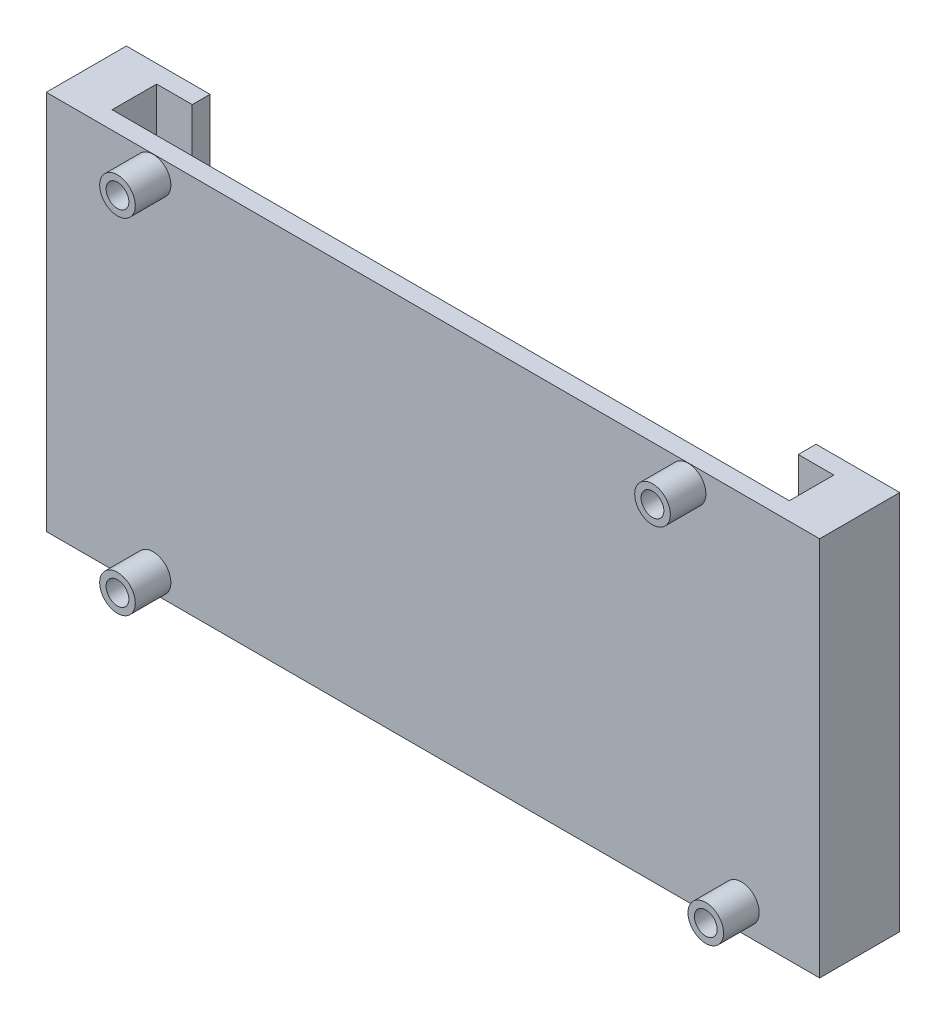
ISO-10303-21;
HEADER;
FILE_DESCRIPTION(('STEP AP214'),'2;1');
FILE_NAME('part.step','',(''),(''),'','','');
FILE_SCHEMA(('AUTOMOTIVE_DESIGN { 1 0 10303 214 1 1 1 1 }'));
ENDSEC;
DATA;
#1=APPLICATION_CONTEXT('core data for automotive mechanical design processes');
#2=APPLICATION_PROTOCOL_DEFINITION('international standard','automotive_design',2000,#1);
#3=PRODUCT_CONTEXT('',#1,'mechanical');
#4=PRODUCT('Part','Part','',(#3));
#5=PRODUCT_RELATED_PRODUCT_CATEGORY('part','',(#4));
#6=PRODUCT_DEFINITION_FORMATION('','',#4);
#7=PRODUCT_DEFINITION_CONTEXT('part definition',#1,'design');
#8=PRODUCT_DEFINITION('design','',#6,#7);
#9=PRODUCT_DEFINITION_SHAPE('','',#8);
#10=(LENGTH_UNIT() NAMED_UNIT(*) SI_UNIT(.MILLI.,.METRE.));
#11=(NAMED_UNIT(*) PLANE_ANGLE_UNIT() SI_UNIT($,.RADIAN.));
#12=(NAMED_UNIT(*) SI_UNIT($,.STERADIAN.) SOLID_ANGLE_UNIT());
#13=UNCERTAINTY_MEASURE_WITH_UNIT(LENGTH_MEASURE(1.E-05),#10,'distance_accuracy_value','');
#14=(GEOMETRIC_REPRESENTATION_CONTEXT(3) GLOBAL_UNCERTAINTY_ASSIGNED_CONTEXT((#13)) GLOBAL_UNIT_ASSIGNED_CONTEXT((#10,
#11,#12)) REPRESENTATION_CONTEXT('',''));
#15=CARTESIAN_POINT('',(0.,0.,0.));
#16=DIRECTION('',(0.,0.,1.));
#17=DIRECTION('',(1.,0.,0.));
#18=AXIS2_PLACEMENT_3D('',#15,#16,#17);
#19=CARTESIAN_POINT('',(-47.55,26.7081,-8.75));
#20=DIRECTION('',(-1.,0.,0.));
#21=DIRECTION('',(0.,-1.,0.));
#22=AXIS2_PLACEMENT_3D('',#19,#20,#21);
#23=PLANE('',#22);
#24=DIRECTION('',(0.,-1.,0.));
#25=VECTOR('',#24,1.);
#26=CARTESIAN_POINT('',(-47.55,26.7081,-6.25));
#27=LINE('',#26,#25);
#28=CARTESIAN_POINT('',(-47.55,26.7081,-6.25));
#29=VERTEX_POINT('',#28);
#30=CARTESIAN_POINT('',(-47.55,-26.7081,-6.25000000000001));
#31=VERTEX_POINT('',#30);
#32=EDGE_CURVE('E167',#29,#31,#27,.T.);
#33=ORIENTED_EDGE('',*,*,#32,.F.);
#34=DIRECTION('',(0.,0.,1.));
#35=VECTOR('',#34,1.);
#36=CARTESIAN_POINT('',(-47.55,26.7081,-8.75));
#37=LINE('',#36,#35);
#38=CARTESIAN_POINT('',(-47.55,26.7081,0.));
#39=VERTEX_POINT('',#38);
#40=EDGE_CURVE('E209',#29,#39,#37,.T.);
#41=ORIENTED_EDGE('',*,*,#40,.T.);
#42=DIRECTION('',(0.,-1.,0.));
#43=VECTOR('',#42,1.);
#44=CARTESIAN_POINT('',(-47.55,26.7081,0.));
#45=LINE('',#44,#43);
#46=CARTESIAN_POINT('',(-47.55,-26.7081,0.));
#47=VERTEX_POINT('',#46);
#48=EDGE_CURVE('E214',#39,#47,#45,.T.);
#49=ORIENTED_EDGE('',*,*,#48,.T.);
#50=DIRECTION('',(0.,0.,1.));
#51=VECTOR('',#50,1.);
#52=CARTESIAN_POINT('',(-47.55,-26.7081,-8.75));
#53=LINE('',#52,#51);
#54=EDGE_CURVE('E61',#31,#47,#53,.T.);
#55=ORIENTED_EDGE('',*,*,#54,.F.);
#56=EDGE_LOOP('',(#33,#41,#49,#55));
#57=FACE_BOUND('',#56,.T.);
#58=ADVANCED_FACE('F45',(#57),#23,.F.);
#59=CARTESIAN_POINT('',(47.55,26.7081,-8.75));
#60=DIRECTION('',(1.,0.,0.));
#61=DIRECTION('',(0.,1.,0.));
#62=AXIS2_PLACEMENT_3D('',#59,#60,#61);
#63=PLANE('',#62);
#64=DIRECTION('',(0.,1.,0.));
#65=VECTOR('',#64,1.);
#66=CARTESIAN_POINT('',(47.55,26.7081,-6.25));
#67=LINE('',#66,#65);
#68=CARTESIAN_POINT('',(47.55,-26.7081,-6.24999999999999));
#69=VERTEX_POINT('',#68);
#70=CARTESIAN_POINT('',(47.55,26.7081,-6.25));
#71=VERTEX_POINT('',#70);
#72=EDGE_CURVE('E185',#69,#71,#67,.T.);
#73=ORIENTED_EDGE('',*,*,#72,.F.);
#74=DIRECTION('',(0.,0.,1.));
#75=VECTOR('',#74,1.);
#76=CARTESIAN_POINT('',(47.55,-26.7081,-8.75));
#77=LINE('',#76,#75);
#78=CARTESIAN_POINT('',(47.55,-26.7081,0.));
#79=VERTEX_POINT('',#78);
#80=EDGE_CURVE('E69',#69,#79,#77,.T.);
#81=ORIENTED_EDGE('',*,*,#80,.T.);
#82=DIRECTION('',(0.,1.,0.));
#83=VECTOR('',#82,1.);
#84=CARTESIAN_POINT('',(47.55,26.7081,0.));
#85=LINE('',#84,#83);
#86=CARTESIAN_POINT('',(47.55,26.7081,0.));
#87=VERTEX_POINT('',#86);
#88=EDGE_CURVE('E217',#79,#87,#85,.T.);
#89=ORIENTED_EDGE('',*,*,#88,.T.);
#90=DIRECTION('',(0.,0.,1.));
#91=VECTOR('',#90,1.);
#92=CARTESIAN_POINT('',(47.55,26.7081,-8.75));
#93=LINE('',#92,#91);
#94=EDGE_CURVE('E233',#71,#87,#93,.T.);
#95=ORIENTED_EDGE('',*,*,#94,.F.);
#96=EDGE_LOOP('',(#73,#81,#89,#95));
#97=FACE_BOUND('',#96,.T.);
#98=ADVANCED_FACE('F364',(#97),#63,.F.);
#99=CARTESIAN_POINT('',(0.,0.,0.));
#100=DIRECTION('',(0.,0.,-1.));
#101=DIRECTION('',(-1.,0.,0.));
#102=AXIS2_PLACEMENT_3D('',#99,#100,#101);
#103=PLANE('',#102);
#104=CARTESIAN_POINT('',(-39.3,24.1681,0.));
#105=DIRECTION('',(0.,0.,1.));
#106=DIRECTION('',(1.,0.,0.));
#107=AXIS2_PLACEMENT_3D('',#104,#105,#106);
#108=CIRCLE('',#107,1.6);
#109=CARTESIAN_POINT('',(-37.7,24.1681,0.));
#110=VERTEX_POINT('',#109);
#111=EDGE_CURVE('E244',#110,#110,#108,.T.);
#112=ORIENTED_EDGE('',*,*,#111,.T.);
#113=EDGE_LOOP('',(#112));
#114=FACE_BOUND('',#113,.T.);
#115=CARTESIAN_POINT('',(35.83,24.1681,0.));
#116=DIRECTION('',(0.,0.,1.));
#117=DIRECTION('',(1.,0.,0.));
#118=AXIS2_PLACEMENT_3D('',#115,#116,#117);
#119=CIRCLE('',#118,1.6);
#120=CARTESIAN_POINT('',(37.43,24.1681,0.));
#121=VERTEX_POINT('',#120);
#122=EDGE_CURVE('E252',#121,#121,#119,.T.);
#123=ORIENTED_EDGE('',*,*,#122,.T.);
#124=EDGE_LOOP('',(#123));
#125=FACE_BOUND('',#124,.T.);
#126=CARTESIAN_POINT('',(43.3118562919391,-23.00810902,0.));
#127=DIRECTION('',(0.,0.,1.));
#128=DIRECTION('',(1.,0.,0.));
#129=AXIS2_PLACEMENT_3D('',#126,#127,#128);
#130=CIRCLE('',#129,1.6);
#131=CARTESIAN_POINT('',(44.9118562919391,-23.00810902,0.));
#132=VERTEX_POINT('',#131);
#133=EDGE_CURVE('E260',#132,#132,#130,.T.);
#134=ORIENTED_EDGE('',*,*,#133,.T.);
#135=EDGE_LOOP('',(#134));
#136=FACE_BOUND('',#135,.T.);
#137=CARTESIAN_POINT('',(-39.3,-24.16810902,0.));
#138=DIRECTION('',(0.,0.,1.));
#139=DIRECTION('',(1.,0.,0.));
#140=AXIS2_PLACEMENT_3D('',#137,#138,#139);
#141=CIRCLE('',#140,1.6);
#142=CARTESIAN_POINT('',(-37.7,-24.16810902,0.));
#143=VERTEX_POINT('',#142);
#144=EDGE_CURVE('E268',#143,#143,#141,.T.);
#145=ORIENTED_EDGE('',*,*,#144,.T.);
#146=EDGE_LOOP('',(#145));
#147=FACE_BOUND('',#146,.T.);
#148=DIRECTION('',(1.,0.,0.));
#149=VECTOR('',#148,1.);
#150=CARTESIAN_POINT('',(-54.3,-26.7081,0.));
#151=LINE('',#150,#149);
#152=EDGE_CURVE('E294',#47,#79,#151,.T.);
#153=ORIENTED_EDGE('',*,*,#152,.F.);
#154=ORIENTED_EDGE('',*,*,#48,.F.);
#155=DIRECTION('',(-1.,0.,0.));
#156=VECTOR('',#155,1.);
#157=CARTESIAN_POINT('',(-54.3,26.7081,0.));
#158=LINE('',#157,#156);
#159=EDGE_CURVE('E288',#87,#39,#158,.T.);
#160=ORIENTED_EDGE('',*,*,#159,.F.);
#161=ORIENTED_EDGE('',*,*,#88,.F.);
#162=EDGE_LOOP('',(#153,#154,#160,#161));
#163=FACE_BOUND('',#162,.T.);
#164=ADVANCED_FACE('F368',(#114,#125,#136,#147,#163),#103,.T.);
#165=CARTESIAN_POINT('',(54.3,-26.7081,2.5));
#166=DIRECTION('',(-1.,0.,0.));
#167=DIRECTION('',(0.,0.,1.));
#168=AXIS2_PLACEMENT_3D('',#165,#166,#167);
#169=PLANE('',#168);
#170=DIRECTION('',(0.,0.,-1.));
#171=VECTOR('',#170,1.);
#172=CARTESIAN_POINT('',(54.3,-26.7081,2.5));
#173=LINE('',#172,#171);
#174=CARTESIAN_POINT('',(54.3,-26.7081,2.5));
#175=VERTEX_POINT('',#174);
#176=CARTESIAN_POINT('',(54.3,-26.7081,-8.75));
#177=VERTEX_POINT('',#176);
#178=EDGE_CURVE('E303',#175,#177,#173,.T.);
#179=ORIENTED_EDGE('',*,*,#178,.T.);
#180=DIRECTION('',(0.,-1.,0.));
#181=VECTOR('',#180,1.);
#182=CARTESIAN_POINT('',(54.3,26.7081,-8.75));
#183=LINE('',#182,#181);
#184=CARTESIAN_POINT('',(54.3,26.7081,-8.75));
#185=VERTEX_POINT('',#184);
#186=EDGE_CURVE('E222',#185,#177,#183,.T.);
#187=ORIENTED_EDGE('',*,*,#186,.F.);
#188=DIRECTION('',(0.,0.,-1.));
#189=VECTOR('',#188,1.);
#190=CARTESIAN_POINT('',(54.3,26.7081,2.5));
#191=LINE('',#190,#189);
#192=CARTESIAN_POINT('',(54.3,26.7081,2.5));
#193=VERTEX_POINT('',#192);
#194=EDGE_CURVE('E317',#193,#185,#191,.T.);
#195=ORIENTED_EDGE('',*,*,#194,.F.);
#196=DIRECTION('',(0.,1.,0.));
#197=VECTOR('',#196,1.);
#198=CARTESIAN_POINT('',(54.3,-26.7081,2.5));
#199=LINE('',#198,#197);
#200=EDGE_CURVE('E289',#175,#193,#199,.T.);
#201=ORIENTED_EDGE('',*,*,#200,.F.);
#202=EDGE_LOOP('',(#179,#187,#195,#201));
#203=FACE_BOUND('',#202,.T.);
#204=ADVANCED_FACE('F47',(#203),#169,.F.);
#205=CARTESIAN_POINT('',(-54.3,26.7081,2.5));
#206=DIRECTION('',(0.,-1.,0.));
#207=DIRECTION('',(0.,0.,-1.));
#208=AXIS2_PLACEMENT_3D('',#205,#206,#207);
#209=PLANE('',#208);
#210=ORIENTED_EDGE('',*,*,#194,.T.);
#211=DIRECTION('',(1.,0.,0.));
#212=VECTOR('',#211,1.);
#213=CARTESIAN_POINT('',(54.3,26.7081,-8.75));
#214=LINE('',#213,#212);
#215=CARTESIAN_POINT('',(42.55,26.7081,-8.75));
#216=VERTEX_POINT('',#215);
#217=EDGE_CURVE('E229',#216,#185,#214,.T.);
#218=ORIENTED_EDGE('',*,*,#217,.F.);
#219=DIRECTION('',(0.,0.,-1.));
#220=VECTOR('',#219,1.);
#221=CARTESIAN_POINT('',(42.55,26.7081,-8.75));
#222=LINE('',#221,#220);
#223=CARTESIAN_POINT('',(42.55,26.7081,-6.25));
#224=VERTEX_POINT('',#223);
#225=EDGE_CURVE('E196',#224,#216,#222,.T.);
#226=ORIENTED_EDGE('',*,*,#225,.F.);
#227=DIRECTION('',(1.,0.,0.));
#228=VECTOR('',#227,1.);
#229=CARTESIAN_POINT('',(42.55,26.7081,-6.25));
#230=LINE('',#229,#228);
#231=EDGE_CURVE('E200',#224,#71,#230,.T.);
#232=ORIENTED_EDGE('',*,*,#231,.T.);
#233=ORIENTED_EDGE('',*,*,#94,.T.);
#234=ORIENTED_EDGE('',*,*,#159,.T.);
#235=ORIENTED_EDGE('',*,*,#40,.F.);
#236=DIRECTION('',(-1.,0.,0.));
#237=VECTOR('',#236,1.);
#238=CARTESIAN_POINT('',(-42.55,26.7081,-6.25));
#239=LINE('',#238,#237);
#240=CARTESIAN_POINT('',(-42.55,26.7081,-6.25));
#241=VERTEX_POINT('',#240);
#242=EDGE_CURVE('E156',#241,#29,#239,.T.);
#243=ORIENTED_EDGE('',*,*,#242,.F.);
#244=DIRECTION('',(0.,0.,1.));
#245=VECTOR('',#244,1.);
#246=CARTESIAN_POINT('',(-42.55,26.7081,-8.75));
#247=LINE('',#246,#245);
#248=CARTESIAN_POINT('',(-42.55,26.7081,-8.75));
#249=VERTEX_POINT('',#248);
#250=EDGE_CURVE('E153',#249,#241,#247,.T.);
#251=ORIENTED_EDGE('',*,*,#250,.F.);
#252=DIRECTION('',(1.,0.,0.));
#253=VECTOR('',#252,1.);
#254=CARTESIAN_POINT('',(-54.3,26.7081,-8.75));
#255=LINE('',#254,#253);
#256=CARTESIAN_POINT('',(-54.3,26.7081,-8.75));
#257=VERTEX_POINT('',#256);
#258=EDGE_CURVE('E139',#257,#249,#255,.T.);
#259=ORIENTED_EDGE('',*,*,#258,.F.);
#260=DIRECTION('',(0.,0.,-1.));
#261=VECTOR('',#260,1.);
#262=CARTESIAN_POINT('',(-54.3,26.7081,2.5));
#263=LINE('',#262,#261);
#264=CARTESIAN_POINT('',(-54.3,26.7081,2.5));
#265=VERTEX_POINT('',#264);
#266=EDGE_CURVE('E314',#265,#257,#263,.T.);
#267=ORIENTED_EDGE('',*,*,#266,.F.);
#268=DIRECTION('',(-1.,0.,0.));
#269=VECTOR('',#268,1.);
#270=CARTESIAN_POINT('',(-54.3,26.7081,2.5));
#271=LINE('',#270,#269);
#272=EDGE_CURVE('E293',#193,#265,#271,.T.);
#273=ORIENTED_EDGE('',*,*,#272,.F.);
#274=EDGE_LOOP('',(#210,#218,#226,#232,#233,#234,#235,#243,#251,#259,#267,#273));
#275=FACE_BOUND('',#274,.T.);
#276=ADVANCED_FACE('F154',(#275),#209,.F.);
#277=CARTESIAN_POINT('',(-54.3,-26.7081,2.5));
#278=DIRECTION('',(1.,0.,0.));
#279=DIRECTION('',(0.,0.,-1.));
#280=AXIS2_PLACEMENT_3D('',#277,#278,#279);
#281=PLANE('',#280);
#282=ORIENTED_EDGE('',*,*,#266,.T.);
#283=DIRECTION('',(0.,1.,0.));
#284=VECTOR('',#283,1.);
#285=CARTESIAN_POINT('',(-54.3,26.7081,-8.75));
#286=LINE('',#285,#284);
#287=CARTESIAN_POINT('',(-54.3,-26.7081,-8.75));
#288=VERTEX_POINT('',#287);
#289=EDGE_CURVE('E146',#288,#257,#286,.T.);
#290=ORIENTED_EDGE('',*,*,#289,.F.);
#291=DIRECTION('',(0.,0.,-1.));
#292=VECTOR('',#291,1.);
#293=CARTESIAN_POINT('',(-54.3,-26.7081,2.5));
#294=LINE('',#293,#292);
#295=CARTESIAN_POINT('',(-54.3,-26.7081,2.5));
#296=VERTEX_POINT('',#295);
#297=EDGE_CURVE('E311',#296,#288,#294,.T.);
#298=ORIENTED_EDGE('',*,*,#297,.F.);
#299=DIRECTION('',(0.,-1.,0.));
#300=VECTOR('',#299,1.);
#301=CARTESIAN_POINT('',(-54.3,-26.7081,2.5));
#302=LINE('',#301,#300);
#303=EDGE_CURVE('E297',#265,#296,#302,.T.);
#304=ORIENTED_EDGE('',*,*,#303,.F.);
#305=EDGE_LOOP('',(#282,#290,#298,#304));
#306=FACE_BOUND('',#305,.T.);
#307=ADVANCED_FACE('F377',(#306),#281,.F.);
#308=CARTESIAN_POINT('',(-54.3,-26.7081,2.5));
#309=DIRECTION('',(0.,1.,0.));
#310=DIRECTION('',(0.,0.,1.));
#311=AXIS2_PLACEMENT_3D('',#308,#309,#310);
#312=PLANE('',#311);
#313=CARTESIAN_POINT('',(-50.925,-26.7081,-3.125));
#314=DIRECTION('',(0.,-1.,0.));
#315=DIRECTION('',(0.,0.,-1.));
#316=AXIS2_PLACEMENT_3D('',#313,#314,#315);
#317=CIRCLE('',#316,3.15);
#318=CARTESIAN_POINT('',(-50.925,-26.7081,-6.275));
#319=VERTEX_POINT('',#318);
#320=EDGE_CURVE('E576',#319,#319,#317,.T.);
#321=ORIENTED_EDGE('',*,*,#320,.F.);
#322=EDGE_LOOP('',(#321));
#323=FACE_BOUND('',#322,.T.);
#324=CARTESIAN_POINT('',(50.925,-26.7081,-3.125));
#325=DIRECTION('',(0.,-1.,0.));
#326=DIRECTION('',(0.,0.,-1.));
#327=AXIS2_PLACEMENT_3D('',#324,#325,#326);
#328=CIRCLE('',#327,3.15);
#329=CARTESIAN_POINT('',(50.925,-26.7081,-6.275));
#330=VERTEX_POINT('',#329);
#331=EDGE_CURVE('E580',#330,#330,#328,.T.);
#332=ORIENTED_EDGE('',*,*,#331,.F.);
#333=EDGE_LOOP('',(#332));
#334=FACE_BOUND('',#333,.T.);
#335=ORIENTED_EDGE('',*,*,#297,.T.);
#336=DIRECTION('',(-1.,0.,0.));
#337=VECTOR('',#336,1.);
#338=CARTESIAN_POINT('',(-54.3,-26.7081,-8.75));
#339=LINE('',#338,#337);
#340=CARTESIAN_POINT('',(-42.55,-26.7081,-8.75000000000001));
#341=VERTEX_POINT('',#340);
#342=EDGE_CURVE('E150',#341,#288,#339,.T.);
#343=ORIENTED_EDGE('',*,*,#342,.F.);
#344=DIRECTION('',(0.,0.,-1.));
#345=VECTOR('',#344,1.);
#346=CARTESIAN_POINT('',(-42.55,-26.7081,-8.75000000000001));
#347=LINE('',#346,#345);
#348=CARTESIAN_POINT('',(-42.55,-26.7081,-6.25000000000001));
#349=VERTEX_POINT('',#348);
#350=EDGE_CURVE('E165',#349,#341,#347,.T.);
#351=ORIENTED_EDGE('',*,*,#350,.F.);
#352=DIRECTION('',(-1.,0.,0.));
#353=VECTOR('',#352,1.);
#354=CARTESIAN_POINT('',(-42.55,-26.7081,-6.25000000000001));
#355=LINE('',#354,#353);
#356=EDGE_CURVE('E179',#349,#31,#355,.T.);
#357=ORIENTED_EDGE('',*,*,#356,.T.);
#358=ORIENTED_EDGE('',*,*,#54,.T.);
#359=ORIENTED_EDGE('',*,*,#152,.T.);
#360=ORIENTED_EDGE('',*,*,#80,.F.);
#361=DIRECTION('',(1.,0.,0.));
#362=VECTOR('',#361,1.);
#363=CARTESIAN_POINT('',(42.55,-26.7081,-6.24999999999999));
#364=LINE('',#363,#362);
#365=CARTESIAN_POINT('',(42.55,-26.7081,-6.24999999999999));
#366=VERTEX_POINT('',#365);
#367=EDGE_CURVE('E206',#366,#69,#364,.T.);
#368=ORIENTED_EDGE('',*,*,#367,.F.);
#369=DIRECTION('',(0.,0.,1.));
#370=VECTOR('',#369,1.);
#371=CARTESIAN_POINT('',(42.55,-26.7081,-8.74999999999999));
#372=LINE('',#371,#370);
#373=CARTESIAN_POINT('',(42.55,-26.7081,-8.74999999999999));
#374=VERTEX_POINT('',#373);
#375=EDGE_CURVE('E190',#374,#366,#372,.T.);
#376=ORIENTED_EDGE('',*,*,#375,.F.);
#377=DIRECTION('',(-1.,0.,0.));
#378=VECTOR('',#377,1.);
#379=CARTESIAN_POINT('',(54.3,-26.7081,-8.75));
#380=LINE('',#379,#378);
#381=EDGE_CURVE('E226',#177,#374,#380,.T.);
#382=ORIENTED_EDGE('',*,*,#381,.F.);
#383=ORIENTED_EDGE('',*,*,#178,.F.);
#384=DIRECTION('',(1.,0.,0.));
#385=VECTOR('',#384,1.);
#386=CARTESIAN_POINT('',(-54.3,-26.7081,2.5));
#387=LINE('',#386,#385);
#388=EDGE_CURVE('E300',#296,#175,#387,.T.);
#389=ORIENTED_EDGE('',*,*,#388,.F.);
#390=EDGE_LOOP('',(#335,#343,#351,#357,#358,#359,#360,#368,#376,#382,#383,#389));
#391=FACE_BOUND('',#390,.T.);
#392=ADVANCED_FACE('F337',(#323,#334,#391),#312,.F.);
#393=CARTESIAN_POINT('',(0.,0.,2.5));
#394=DIRECTION('',(0.,0.,-1.));
#395=DIRECTION('',(-1.,0.,0.));
#396=AXIS2_PLACEMENT_3D('',#393,#394,#395);
#397=PLANE('',#396);
#398=CARTESIAN_POINT('',(-39.3,-24.16810902,2.5));
#399=DIRECTION('',(0.,0.,-1.));
#400=DIRECTION('',(-1.,0.,0.));
#401=AXIS2_PLACEMENT_3D('',#398,#399,#400);
#402=CIRCLE('',#401,2.5);
#403=CARTESIAN_POINT('',(-41.8,-24.16810902,2.5));
#404=VERTEX_POINT('',#403);
#405=EDGE_CURVE('E11',#404,#404,#402,.F.);
#406=ORIENTED_EDGE('',*,*,#405,.F.);
#407=EDGE_LOOP('',(#406));
#408=FACE_BOUND('',#407,.T.);
#409=CARTESIAN_POINT('',(43.3118562919391,-23.00810902,2.5));
#410=DIRECTION('',(0.,0.,-1.));
#411=DIRECTION('',(-1.,0.,0.));
#412=AXIS2_PLACEMENT_3D('',#409,#410,#411);
#413=CIRCLE('',#412,2.5);
#414=CARTESIAN_POINT('',(40.8118562919391,-23.00810902,2.5));
#415=VERTEX_POINT('',#414);
#416=EDGE_CURVE('E54',#415,#415,#413,.F.);
#417=ORIENTED_EDGE('',*,*,#416,.F.);
#418=EDGE_LOOP('',(#417));
#419=FACE_BOUND('',#418,.T.);
#420=CARTESIAN_POINT('',(35.83,24.1681,2.5));
#421=DIRECTION('',(0.,0.,-1.));
#422=DIRECTION('',(-1.,0.,0.));
#423=AXIS2_PLACEMENT_3D('',#420,#421,#422);
#424=CIRCLE('',#423,2.5);
#425=CARTESIAN_POINT('',(33.33,24.1681,2.5));
#426=VERTEX_POINT('',#425);
#427=EDGE_CURVE('E324',#426,#426,#424,.F.);
#428=ORIENTED_EDGE('',*,*,#427,.F.);
#429=EDGE_LOOP('',(#428));
#430=FACE_BOUND('',#429,.T.);
#431=CARTESIAN_POINT('',(-39.3,24.1681,2.5));
#432=DIRECTION('',(0.,0.,-1.));
#433=DIRECTION('',(-1.,0.,0.));
#434=AXIS2_PLACEMENT_3D('',#431,#432,#433);
#435=CIRCLE('',#434,2.5);
#436=CARTESIAN_POINT('',(-41.8,24.1681,2.5));
#437=VERTEX_POINT('',#436);
#438=EDGE_CURVE('E320',#437,#437,#435,.F.);
#439=ORIENTED_EDGE('',*,*,#438,.F.);
#440=EDGE_LOOP('',(#439));
#441=FACE_BOUND('',#440,.T.);
#442=ORIENTED_EDGE('',*,*,#200,.T.);
#443=ORIENTED_EDGE('',*,*,#272,.T.);
#444=ORIENTED_EDGE('',*,*,#303,.T.);
#445=ORIENTED_EDGE('',*,*,#388,.T.);
#446=EDGE_LOOP('',(#442,#443,#444,#445));
#447=FACE_BOUND('',#446,.T.);
#448=ADVANCED_FACE('F333',(#408,#419,#430,#441,#447),#397,.F.);
#449=CARTESIAN_POINT('',(-39.3,24.1681,7.5));
#450=DIRECTION('',(0.,0.,-1.));
#451=DIRECTION('',(-1.,0.,0.));
#452=AXIS2_PLACEMENT_3D('',#449,#450,#451);
#453=CYLINDRICAL_SURFACE('',#452,2.5);
#454=CARTESIAN_POINT('',(-39.3,24.1681,7.5));
#455=DIRECTION('',(0.,0.,1.));
#456=DIRECTION('',(1.,0.,0.));
#457=AXIS2_PLACEMENT_3D('',#454,#455,#456);
#458=CIRCLE('',#457,2.5);
#459=CARTESIAN_POINT('',(-36.8,24.1681,7.5));
#460=VERTEX_POINT('',#459);
#461=EDGE_CURVE('E284',#460,#460,#458,.T.);
#462=ORIENTED_EDGE('',*,*,#461,.F.);
#463=EDGE_LOOP('',(#462));
#464=FACE_BOUND('',#463,.T.);
#465=ORIENTED_EDGE('',*,*,#438,.T.);
#466=EDGE_LOOP('',(#465));
#467=FACE_BOUND('',#466,.T.);
#468=ADVANCED_FACE('F336',(#464,#467),#453,.T.);
#469=CARTESIAN_POINT('',(-39.3,24.1681,7.5));
#470=DIRECTION('',(0.,0.,1.));
#471=DIRECTION('',(1.,0.,0.));
#472=AXIS2_PLACEMENT_3D('',#469,#470,#471);
#473=PLANE('',#472);
#474=CARTESIAN_POINT('',(-39.3,24.1681,7.5));
#475=DIRECTION('',(0.,0.,1.));
#476=DIRECTION('',(1.,0.,0.));
#477=AXIS2_PLACEMENT_3D('',#474,#475,#476);
#478=CIRCLE('',#477,1.6);
#479=CARTESIAN_POINT('',(-37.7,24.1681,7.5));
#480=VERTEX_POINT('',#479);
#481=EDGE_CURVE('E240',#480,#480,#478,.T.);
#482=ORIENTED_EDGE('',*,*,#481,.F.);
#483=EDGE_LOOP('',(#482));
#484=FACE_BOUND('',#483,.T.);
#485=ORIENTED_EDGE('',*,*,#461,.T.);
#486=EDGE_LOOP('',(#485));
#487=FACE_BOUND('',#486,.T.);
#488=ADVANCED_FACE('F433',(#484,#487),#473,.T.);
#489=CARTESIAN_POINT('',(35.83,24.1681,7.5));
#490=DIRECTION('',(0.,0.,-1.));
#491=DIRECTION('',(-1.,0.,0.));
#492=AXIS2_PLACEMENT_3D('',#489,#490,#491);
#493=CYLINDRICAL_SURFACE('',#492,2.5);
#494=CARTESIAN_POINT('',(35.83,24.1681,7.5));
#495=DIRECTION('',(0.,0.,1.));
#496=DIRECTION('',(1.,0.,0.));
#497=AXIS2_PLACEMENT_3D('',#494,#495,#496);
#498=CIRCLE('',#497,2.5);
#499=CARTESIAN_POINT('',(38.33,24.1681,7.5));
#500=VERTEX_POINT('',#499);
#501=EDGE_CURVE('E280',#500,#500,#498,.T.);
#502=ORIENTED_EDGE('',*,*,#501,.F.);
#503=EDGE_LOOP('',(#502));
#504=FACE_BOUND('',#503,.T.);
#505=ORIENTED_EDGE('',*,*,#427,.T.);
#506=EDGE_LOOP('',(#505));
#507=FACE_BOUND('',#506,.T.);
#508=ADVANCED_FACE('F430',(#504,#507),#493,.T.);
#509=CARTESIAN_POINT('',(35.83,24.1681,7.5));
#510=DIRECTION('',(0.,0.,1.));
#511=DIRECTION('',(1.,0.,0.));
#512=AXIS2_PLACEMENT_3D('',#509,#510,#511);
#513=PLANE('',#512);
#514=CARTESIAN_POINT('',(35.83,24.1681,7.5));
#515=DIRECTION('',(0.,0.,1.));
#516=DIRECTION('',(1.,0.,0.));
#517=AXIS2_PLACEMENT_3D('',#514,#515,#516);
#518=CIRCLE('',#517,1.6);
#519=CARTESIAN_POINT('',(37.43,24.1681,7.5));
#520=VERTEX_POINT('',#519);
#521=EDGE_CURVE('E248',#520,#520,#518,.T.);
#522=ORIENTED_EDGE('',*,*,#521,.F.);
#523=EDGE_LOOP('',(#522));
#524=FACE_BOUND('',#523,.T.);
#525=ORIENTED_EDGE('',*,*,#501,.T.);
#526=EDGE_LOOP('',(#525));
#527=FACE_BOUND('',#526,.T.);
#528=ADVANCED_FACE('F425',(#524,#527),#513,.T.);
#529=CARTESIAN_POINT('',(43.3118562919391,-23.00810902,7.5));
#530=DIRECTION('',(0.,0.,-1.));
#531=DIRECTION('',(-1.,0.,0.));
#532=AXIS2_PLACEMENT_3D('',#529,#530,#531);
#533=CYLINDRICAL_SURFACE('',#532,2.5);
#534=CARTESIAN_POINT('',(43.3118562919391,-23.00810902,7.5));
#535=DIRECTION('',(0.,0.,1.));
#536=DIRECTION('',(1.,0.,0.));
#537=AXIS2_PLACEMENT_3D('',#534,#535,#536);
#538=CIRCLE('',#537,2.5);
#539=CARTESIAN_POINT('',(45.8118562919391,-23.00810902,7.5));
#540=VERTEX_POINT('',#539);
#541=EDGE_CURVE('E276',#540,#540,#538,.T.);
#542=ORIENTED_EDGE('',*,*,#541,.F.);
#543=EDGE_LOOP('',(#542));
#544=FACE_BOUND('',#543,.T.);
#545=ORIENTED_EDGE('',*,*,#416,.T.);
#546=EDGE_LOOP('',(#545));
#547=FACE_BOUND('',#546,.T.);
#548=ADVANCED_FACE('F331',(#544,#547),#533,.T.);
#549=CARTESIAN_POINT('',(43.3118562919391,-23.00810902,7.5));
#550=DIRECTION('',(0.,0.,1.));
#551=DIRECTION('',(1.,0.,0.));
#552=AXIS2_PLACEMENT_3D('',#549,#550,#551);
#553=PLANE('',#552);
#554=CARTESIAN_POINT('',(43.3118562919391,-23.00810902,7.5));
#555=DIRECTION('',(0.,0.,1.));
#556=DIRECTION('',(1.,0.,0.));
#557=AXIS2_PLACEMENT_3D('',#554,#555,#556);
#558=CIRCLE('',#557,1.6);
#559=CARTESIAN_POINT('',(44.9118562919391,-23.00810902,7.5));
#560=VERTEX_POINT('',#559);
#561=EDGE_CURVE('E256',#560,#560,#558,.T.);
#562=ORIENTED_EDGE('',*,*,#561,.F.);
#563=EDGE_LOOP('',(#562));
#564=FACE_BOUND('',#563,.T.);
#565=ORIENTED_EDGE('',*,*,#541,.T.);
#566=EDGE_LOOP('',(#565));
#567=FACE_BOUND('',#566,.T.);
#568=ADVANCED_FACE('F418',(#564,#567),#553,.T.);
#569=CARTESIAN_POINT('',(-39.3,-24.16810902,7.5));
#570=DIRECTION('',(0.,0.,-1.));
#571=DIRECTION('',(-1.,0.,0.));
#572=AXIS2_PLACEMENT_3D('',#569,#570,#571);
#573=CYLINDRICAL_SURFACE('',#572,2.5);
#574=CARTESIAN_POINT('',(-39.3,-24.16810902,7.5));
#575=DIRECTION('',(0.,0.,1.));
#576=DIRECTION('',(1.,0.,0.));
#577=AXIS2_PLACEMENT_3D('',#574,#575,#576);
#578=CIRCLE('',#577,2.5);
#579=CARTESIAN_POINT('',(-36.8,-24.16810902,7.5));
#580=VERTEX_POINT('',#579);
#581=EDGE_CURVE('E272',#580,#580,#578,.T.);
#582=ORIENTED_EDGE('',*,*,#581,.F.);
#583=EDGE_LOOP('',(#582));
#584=FACE_BOUND('',#583,.T.);
#585=ORIENTED_EDGE('',*,*,#405,.T.);
#586=EDGE_LOOP('',(#585));
#587=FACE_BOUND('',#586,.T.);
#588=ADVANCED_FACE('F415',(#584,#587),#573,.T.);
#589=CARTESIAN_POINT('',(-39.3,-24.16810902,7.5));
#590=DIRECTION('',(0.,0.,1.));
#591=DIRECTION('',(1.,0.,0.));
#592=AXIS2_PLACEMENT_3D('',#589,#590,#591);
#593=PLANE('',#592);
#594=CARTESIAN_POINT('',(-39.3,-24.16810902,7.5));
#595=DIRECTION('',(0.,0.,1.));
#596=DIRECTION('',(1.,0.,0.));
#597=AXIS2_PLACEMENT_3D('',#594,#595,#596);
#598=CIRCLE('',#597,1.6);
#599=CARTESIAN_POINT('',(-37.7,-24.16810902,7.5));
#600=VERTEX_POINT('',#599);
#601=EDGE_CURVE('E264',#600,#600,#598,.T.);
#602=ORIENTED_EDGE('',*,*,#601,.F.);
#603=EDGE_LOOP('',(#602));
#604=FACE_BOUND('',#603,.T.);
#605=ORIENTED_EDGE('',*,*,#581,.T.);
#606=EDGE_LOOP('',(#605));
#607=FACE_BOUND('',#606,.T.);
#608=ADVANCED_FACE('F413',(#604,#607),#593,.T.);
#609=CARTESIAN_POINT('',(-39.3,-24.16810902,7.5));
#610=DIRECTION('',(0.,0.,1.));
#611=DIRECTION('',(1.,0.,0.));
#612=AXIS2_PLACEMENT_3D('',#609,#610,#611);
#613=CYLINDRICAL_SURFACE('',#612,1.6);
#614=ORIENTED_EDGE('',*,*,#144,.F.);
#615=EDGE_LOOP('',(#614));
#616=FACE_BOUND('',#615,.T.);
#617=ORIENTED_EDGE('',*,*,#601,.T.);
#618=EDGE_LOOP('',(#617));
#619=FACE_BOUND('',#618,.T.);
#620=ADVANCED_FACE('F409',(#616,#619),#613,.F.);
#621=CARTESIAN_POINT('',(43.3118562919391,-23.00810902,7.5));
#622=DIRECTION('',(0.,0.,1.));
#623=DIRECTION('',(1.,0.,0.));
#624=AXIS2_PLACEMENT_3D('',#621,#622,#623);
#625=CYLINDRICAL_SURFACE('',#624,1.6);
#626=ORIENTED_EDGE('',*,*,#133,.F.);
#627=EDGE_LOOP('',(#626));
#628=FACE_BOUND('',#627,.T.);
#629=ORIENTED_EDGE('',*,*,#561,.T.);
#630=EDGE_LOOP('',(#629));
#631=FACE_BOUND('',#630,.T.);
#632=ADVANCED_FACE('F405',(#628,#631),#625,.F.);
#633=CARTESIAN_POINT('',(35.83,24.1681,7.5));
#634=DIRECTION('',(0.,0.,1.));
#635=DIRECTION('',(1.,0.,0.));
#636=AXIS2_PLACEMENT_3D('',#633,#634,#635);
#637=CYLINDRICAL_SURFACE('',#636,1.6);
#638=ORIENTED_EDGE('',*,*,#122,.F.);
#639=EDGE_LOOP('',(#638));
#640=FACE_BOUND('',#639,.T.);
#641=ORIENTED_EDGE('',*,*,#521,.T.);
#642=EDGE_LOOP('',(#641));
#643=FACE_BOUND('',#642,.T.);
#644=ADVANCED_FACE('F401',(#640,#643),#637,.F.);
#645=CARTESIAN_POINT('',(-39.3,24.1681,7.5));
#646=DIRECTION('',(0.,0.,1.));
#647=DIRECTION('',(1.,0.,0.));
#648=AXIS2_PLACEMENT_3D('',#645,#646,#647);
#649=CYLINDRICAL_SURFACE('',#648,1.6);
#650=ORIENTED_EDGE('',*,*,#111,.F.);
#651=EDGE_LOOP('',(#650));
#652=FACE_BOUND('',#651,.T.);
#653=ORIENTED_EDGE('',*,*,#481,.T.);
#654=EDGE_LOOP('',(#653));
#655=FACE_BOUND('',#654,.T.);
#656=ADVANCED_FACE('F397',(#652,#655),#649,.F.);
#657=CARTESIAN_POINT('',(0.,0.,-8.75));
#658=DIRECTION('',(0.,0.,-1.));
#659=DIRECTION('',(-1.,0.,0.));
#660=AXIS2_PLACEMENT_3D('',#657,#658,#659);
#661=PLANE('',#660);
#662=ORIENTED_EDGE('',*,*,#186,.T.);
#663=ORIENTED_EDGE('',*,*,#381,.T.);
#664=DIRECTION('',(0.,-1.,0.));
#665=VECTOR('',#664,1.);
#666=CARTESIAN_POINT('',(42.55,26.7081,-8.75));
#667=LINE('',#666,#665);
#668=EDGE_CURVE('E186',#216,#374,#667,.T.);
#669=ORIENTED_EDGE('',*,*,#668,.F.);
#670=ORIENTED_EDGE('',*,*,#217,.T.);
#671=EDGE_LOOP('',(#662,#663,#669,#670));
#672=FACE_BOUND('',#671,.T.);
#673=ADVANCED_FACE('F353',(#672),#661,.T.);
#674=CARTESIAN_POINT('',(0.,0.,-8.75));
#675=DIRECTION('',(0.,0.,1.));
#676=DIRECTION('',(1.,0.,0.));
#677=AXIS2_PLACEMENT_3D('',#674,#675,#676);
#678=PLANE('',#677);
#679=ORIENTED_EDGE('',*,*,#289,.T.);
#680=ORIENTED_EDGE('',*,*,#258,.T.);
#681=DIRECTION('',(0.,1.,0.));
#682=VECTOR('',#681,1.);
#683=CARTESIAN_POINT('',(-42.55,26.7081,-8.75));
#684=LINE('',#683,#682);
#685=EDGE_CURVE('E144',#341,#249,#684,.T.);
#686=ORIENTED_EDGE('',*,*,#685,.F.);
#687=ORIENTED_EDGE('',*,*,#342,.T.);
#688=EDGE_LOOP('',(#679,#680,#686,#687));
#689=FACE_BOUND('',#688,.T.);
#690=ADVANCED_FACE('F141',(#689),#678,.F.);
#691=CARTESIAN_POINT('',(42.55,26.7081,-6.25));
#692=DIRECTION('',(0.,0.,-1.));
#693=DIRECTION('',(0.,1.,0.));
#694=AXIS2_PLACEMENT_3D('',#691,#692,#693);
#695=PLANE('',#694);
#696=ORIENTED_EDGE('',*,*,#72,.T.);
#697=ORIENTED_EDGE('',*,*,#231,.F.);
#698=DIRECTION('',(0.,1.,0.));
#699=VECTOR('',#698,1.);
#700=CARTESIAN_POINT('',(42.55,26.7081,-6.25));
#701=LINE('',#700,#699);
#702=EDGE_CURVE('E193',#366,#224,#701,.T.);
#703=ORIENTED_EDGE('',*,*,#702,.F.);
#704=ORIENTED_EDGE('',*,*,#367,.T.);
#705=EDGE_LOOP('',(#696,#697,#703,#704));
#706=FACE_BOUND('',#705,.T.);
#707=ADVANCED_FACE('F379',(#706),#695,.F.);
#708=CARTESIAN_POINT('',(42.55,0.,0.));
#709=DIRECTION('',(-1.,0.,0.));
#710=DIRECTION('',(0.,-1.,0.));
#711=AXIS2_PLACEMENT_3D('',#708,#709,#710);
#712=PLANE('',#711);
#713=ORIENTED_EDGE('',*,*,#668,.T.);
#714=ORIENTED_EDGE('',*,*,#375,.T.);
#715=ORIENTED_EDGE('',*,*,#702,.T.);
#716=ORIENTED_EDGE('',*,*,#225,.T.);
#717=EDGE_LOOP('',(#713,#714,#715,#716));
#718=FACE_BOUND('',#717,.T.);
#719=ADVANCED_FACE('F357',(#718),#712,.T.);
#720=CARTESIAN_POINT('',(-42.55,26.7081,-6.25));
#721=DIRECTION('',(0.,0.,-1.));
#722=DIRECTION('',(0.,1.,0.));
#723=AXIS2_PLACEMENT_3D('',#720,#721,#722);
#724=PLANE('',#723);
#725=ORIENTED_EDGE('',*,*,#32,.T.);
#726=ORIENTED_EDGE('',*,*,#356,.F.);
#727=DIRECTION('',(0.,-1.,0.));
#728=VECTOR('',#727,1.);
#729=CARTESIAN_POINT('',(-42.55,26.7081,-6.25));
#730=LINE('',#729,#728);
#731=EDGE_CURVE('E160',#241,#349,#730,.T.);
#732=ORIENTED_EDGE('',*,*,#731,.F.);
#733=ORIENTED_EDGE('',*,*,#242,.T.);
#734=EDGE_LOOP('',(#725,#726,#732,#733));
#735=FACE_BOUND('',#734,.T.);
#736=ADVANCED_FACE('F374',(#735),#724,.F.);
#737=CARTESIAN_POINT('',(-42.55,0.,0.));
#738=DIRECTION('',(-1.,0.,0.));
#739=DIRECTION('',(0.,-1.,0.));
#740=AXIS2_PLACEMENT_3D('',#737,#738,#739);
#741=PLANE('',#740);
#742=ORIENTED_EDGE('',*,*,#685,.T.);
#743=ORIENTED_EDGE('',*,*,#250,.T.);
#744=ORIENTED_EDGE('',*,*,#731,.T.);
#745=ORIENTED_EDGE('',*,*,#350,.T.);
#746=EDGE_LOOP('',(#742,#743,#744,#745));
#747=FACE_BOUND('',#746,.T.);
#748=ADVANCED_FACE('F163',(#747),#741,.F.);
#749=CARTESIAN_POINT('',(50.925,-24.0081,-3.125));
#750=DIRECTION('',(0.,-1.,0.));
#751=DIRECTION('',(0.,0.,-1.));
#752=AXIS2_PLACEMENT_3D('',#749,#750,#751);
#753=CYLINDRICAL_SURFACE('',#752,3.15);
#754=CARTESIAN_POINT('',(50.925,-24.0081,-3.125));
#755=DIRECTION('',(0.,-1.,0.));
#756=DIRECTION('',(0.,0.,-1.));
#757=AXIS2_PLACEMENT_3D('',#754,#755,#756);
#758=CIRCLE('',#757,3.15);
#759=CARTESIAN_POINT('',(50.925,-24.0081,-6.275));
#760=VERTEX_POINT('',#759);
#761=EDGE_CURVE('E173',#760,#760,#758,.T.);
#762=CARTESIAN_POINT('',(50.925,-24.0081,-6.275));
#763=CARTESIAN_POINT('',(50.925,-24.036225,-6.275));
#764=CARTESIAN_POINT('',(50.925,-24.06435,-6.275));
#765=CARTESIAN_POINT('',(50.925,-24.1206,-6.275));
#766=CARTESIAN_POINT('',(50.925,-24.148725,-6.275));
#767=CARTESIAN_POINT('',(50.925,-24.204975,-6.275));
#768=CARTESIAN_POINT('',(50.925,-24.2331,-6.275));
#769=CARTESIAN_POINT('',(50.925,-24.28935,-6.275));
#770=CARTESIAN_POINT('',(50.925,-24.317475,-6.275));
#771=CARTESIAN_POINT('',(50.925,-24.373725,-6.275));
#772=CARTESIAN_POINT('',(50.925,-24.40185,-6.275));
#773=CARTESIAN_POINT('',(50.925,-24.4581,-6.275));
#774=CARTESIAN_POINT('',(50.925,-24.486225,-6.275));
#775=CARTESIAN_POINT('',(50.925,-24.542475,-6.275));
#776=CARTESIAN_POINT('',(50.925,-24.5706,-6.275));
#777=CARTESIAN_POINT('',(50.925,-24.62685,-6.275));
#778=CARTESIAN_POINT('',(50.925,-24.654975,-6.275));
#779=CARTESIAN_POINT('',(50.925,-24.711225,-6.275));
#780=CARTESIAN_POINT('',(50.925,-24.73935,-6.275));
#781=CARTESIAN_POINT('',(50.925,-24.7956,-6.275));
#782=CARTESIAN_POINT('',(50.925,-24.823725,-6.275));
#783=CARTESIAN_POINT('',(50.925,-24.879975,-6.275));
#784=CARTESIAN_POINT('',(50.925,-24.9081,-6.275));
#785=CARTESIAN_POINT('',(50.925,-24.96435,-6.275));
#786=CARTESIAN_POINT('',(50.925,-24.992475,-6.275));
#787=CARTESIAN_POINT('',(50.925,-25.048725,-6.275));
#788=CARTESIAN_POINT('',(50.925,-25.07685,-6.275));
#789=CARTESIAN_POINT('',(50.925,-25.1331,-6.275));
#790=CARTESIAN_POINT('',(50.925,-25.161225,-6.275));
#791=CARTESIAN_POINT('',(50.925,-25.217475,-6.275));
#792=CARTESIAN_POINT('',(50.925,-25.2456,-6.275));
#793=CARTESIAN_POINT('',(50.925,-25.30185,-6.275));
#794=CARTESIAN_POINT('',(50.925,-25.329975,-6.275));
#795=CARTESIAN_POINT('',(50.925,-25.386225,-6.275));
#796=CARTESIAN_POINT('',(50.925,-25.41435,-6.275));
#797=CARTESIAN_POINT('',(50.925,-25.4706,-6.275));
#798=CARTESIAN_POINT('',(50.925,-25.498725,-6.275));
#799=CARTESIAN_POINT('',(50.925,-25.554975,-6.275));
#800=CARTESIAN_POINT('',(50.925,-25.5831,-6.275));
#801=CARTESIAN_POINT('',(50.925,-25.63935,-6.275));
#802=CARTESIAN_POINT('',(50.925,-25.667475,-6.275));
#803=CARTESIAN_POINT('',(50.925,-25.723725,-6.275));
#804=CARTESIAN_POINT('',(50.925,-25.75185,-6.275));
#805=CARTESIAN_POINT('',(50.925,-25.8081,-6.275));
#806=CARTESIAN_POINT('',(50.925,-25.836225,-6.275));
#807=CARTESIAN_POINT('',(50.925,-25.892475,-6.275));
#808=CARTESIAN_POINT('',(50.925,-25.9206,-6.275));
#809=CARTESIAN_POINT('',(50.925,-25.97685,-6.275));
#810=CARTESIAN_POINT('',(50.925,-26.004975,-6.275));
#811=CARTESIAN_POINT('',(50.925,-26.061225,-6.275));
#812=CARTESIAN_POINT('',(50.925,-26.08935,-6.275));
#813=CARTESIAN_POINT('',(50.925,-26.1456,-6.275));
#814=CARTESIAN_POINT('',(50.925,-26.173725,-6.275));
#815=CARTESIAN_POINT('',(50.925,-26.229975,-6.275));
#816=CARTESIAN_POINT('',(50.925,-26.2581,-6.275));
#817=CARTESIAN_POINT('',(50.925,-26.31435,-6.275));
#818=CARTESIAN_POINT('',(50.925,-26.342475,-6.275));
#819=CARTESIAN_POINT('',(50.925,-26.398725,-6.275));
#820=CARTESIAN_POINT('',(50.925,-26.42685,-6.275));
#821=CARTESIAN_POINT('',(50.925,-26.4831,-6.275));
#822=CARTESIAN_POINT('',(50.925,-26.511225,-6.275));
#823=CARTESIAN_POINT('',(50.925,-26.567475,-6.275));
#824=CARTESIAN_POINT('',(50.925,-26.5956,-6.275));
#825=CARTESIAN_POINT('',(50.925,-26.65185,-6.275));
#826=CARTESIAN_POINT('',(50.925,-26.679975,-6.275));
#827=CARTESIAN_POINT('',(50.925,-26.7081,-6.275));
#828=B_SPLINE_CURVE_WITH_KNOTS('',3,(#762,#763,#764,#765,#766,#767,#768,#769,#770,#771,#772,
#773,#774,#775,#776,#777,#778,#779,#780,#781,#782,#783,#784,#785,#786,#787,#788,#789,#790,#791,
#792,#793,#794,#795,#796,#797,#798,#799,#800,#801,#802,#803,#804,#805,#806,#807,#808,#809,#810,
#811,#812,#813,#814,#815,#816,#817,#818,#819,#820,#821,#822,#823,#824,#825,#826,#827),
.UNSPECIFIED.,.F.,.F.,(4,2,2,2,2,2,2,2,2,2,2,2,2,2,2,2,2,2,2,2,2,2,2,2,2,2,2,2,2,2,2,2,4),(0.,
0.0843749999999976,0.168749999999999,0.253125,0.337499999999998,0.421874999999999,0.50625,
0.590624999999997,0.674999999999998,0.759375,0.843749999999997,0.928124999999998,1.0125,
1.096875,1.18125,1.265625,1.35,1.434375,1.51875,1.603125,1.6875,1.771875,1.85625,1.940625,2.025,
2.109375,2.19375,2.278125,2.3625,2.446875,2.53125,2.615625,2.7),.UNSPECIFIED.);
#829=EDGE_CURVE('BSEAM532',#760,#330,#828,.T.);
#830=ORIENTED_EDGE('',*,*,#761,.F.);
#831=ORIENTED_EDGE('',*,*,#331,.T.);
#832=ORIENTED_EDGE('',*,*,#829,.T.);
#833=ORIENTED_EDGE('',*,*,#829,.F.);
#834=EDGE_LOOP('',(#830,#832,#831,#833));
#835=FACE_BOUND('',#834,.T.);
#836=ADVANCED_FACE('F532',(#835),#753,.F.);
#837=CARTESIAN_POINT('',(50.925,-24.0081,-3.125));
#838=DIRECTION('',(0.,-1.,0.));
#839=DIRECTION('',(0.,0.,-1.));
#840=AXIS2_PLACEMENT_3D('',#837,#838,#839);
#841=PLANE('',#840);
#842=ORIENTED_EDGE('',*,*,#761,.T.);
#843=EDGE_LOOP('',(#842));
#844=FACE_BOUND('',#843,.T.);
#845=ADVANCED_FACE('F540',(#844),#841,.T.);
#846=CARTESIAN_POINT('',(-50.925,-24.0081,-3.125));
#847=DIRECTION('',(0.,-1.,0.));
#848=DIRECTION('',(0.,0.,-1.));
#849=AXIS2_PLACEMENT_3D('',#846,#847,#848);
#850=CYLINDRICAL_SURFACE('',#849,3.15);
#851=CARTESIAN_POINT('',(-50.925,-24.0081,-3.125));
#852=DIRECTION('',(0.,-1.,0.));
#853=DIRECTION('',(0.,0.,-1.));
#854=AXIS2_PLACEMENT_3D('',#851,#852,#853);
#855=CIRCLE('',#854,3.15);
#856=CARTESIAN_POINT('',(-50.925,-24.0081,-6.275));
#857=VERTEX_POINT('',#856);
#858=EDGE_CURVE('E170',#857,#857,#855,.T.);
#859=CARTESIAN_POINT('',(-50.925,-24.0081,-6.275));
#860=CARTESIAN_POINT('',(-50.925,-24.036225,-6.275));
#861=CARTESIAN_POINT('',(-50.925,-24.06435,-6.275));
#862=CARTESIAN_POINT('',(-50.925,-24.1206,-6.275));
#863=CARTESIAN_POINT('',(-50.925,-24.148725,-6.275));
#864=CARTESIAN_POINT('',(-50.925,-24.204975,-6.275));
#865=CARTESIAN_POINT('',(-50.925,-24.2331,-6.275));
#866=CARTESIAN_POINT('',(-50.925,-24.28935,-6.275));
#867=CARTESIAN_POINT('',(-50.925,-24.317475,-6.275));
#868=CARTESIAN_POINT('',(-50.925,-24.373725,-6.275));
#869=CARTESIAN_POINT('',(-50.925,-24.40185,-6.275));
#870=CARTESIAN_POINT('',(-50.925,-24.4581,-6.275));
#871=CARTESIAN_POINT('',(-50.925,-24.486225,-6.275));
#872=CARTESIAN_POINT('',(-50.925,-24.542475,-6.275));
#873=CARTESIAN_POINT('',(-50.925,-24.5706,-6.275));
#874=CARTESIAN_POINT('',(-50.925,-24.62685,-6.275));
#875=CARTESIAN_POINT('',(-50.925,-24.654975,-6.275));
#876=CARTESIAN_POINT('',(-50.925,-24.711225,-6.275));
#877=CARTESIAN_POINT('',(-50.925,-24.73935,-6.275));
#878=CARTESIAN_POINT('',(-50.925,-24.7956,-6.275));
#879=CARTESIAN_POINT('',(-50.925,-24.823725,-6.275));
#880=CARTESIAN_POINT('',(-50.925,-24.879975,-6.275));
#881=CARTESIAN_POINT('',(-50.925,-24.9081,-6.275));
#882=CARTESIAN_POINT('',(-50.925,-24.96435,-6.275));
#883=CARTESIAN_POINT('',(-50.925,-24.992475,-6.275));
#884=CARTESIAN_POINT('',(-50.925,-25.048725,-6.275));
#885=CARTESIAN_POINT('',(-50.925,-25.07685,-6.275));
#886=CARTESIAN_POINT('',(-50.925,-25.1331,-6.275));
#887=CARTESIAN_POINT('',(-50.925,-25.161225,-6.275));
#888=CARTESIAN_POINT('',(-50.925,-25.217475,-6.275));
#889=CARTESIAN_POINT('',(-50.925,-25.2456,-6.275));
#890=CARTESIAN_POINT('',(-50.925,-25.30185,-6.275));
#891=CARTESIAN_POINT('',(-50.925,-25.329975,-6.275));
#892=CARTESIAN_POINT('',(-50.925,-25.386225,-6.275));
#893=CARTESIAN_POINT('',(-50.925,-25.41435,-6.275));
#894=CARTESIAN_POINT('',(-50.925,-25.4706,-6.275));
#895=CARTESIAN_POINT('',(-50.925,-25.498725,-6.275));
#896=CARTESIAN_POINT('',(-50.925,-25.554975,-6.275));
#897=CARTESIAN_POINT('',(-50.925,-25.5831,-6.275));
#898=CARTESIAN_POINT('',(-50.925,-25.63935,-6.275));
#899=CARTESIAN_POINT('',(-50.925,-25.667475,-6.275));
#900=CARTESIAN_POINT('',(-50.925,-25.723725,-6.275));
#901=CARTESIAN_POINT('',(-50.925,-25.75185,-6.275));
#902=CARTESIAN_POINT('',(-50.925,-25.8081,-6.275));
#903=CARTESIAN_POINT('',(-50.925,-25.836225,-6.275));
#904=CARTESIAN_POINT('',(-50.925,-25.892475,-6.275));
#905=CARTESIAN_POINT('',(-50.925,-25.9206,-6.275));
#906=CARTESIAN_POINT('',(-50.925,-25.97685,-6.275));
#907=CARTESIAN_POINT('',(-50.925,-26.004975,-6.275));
#908=CARTESIAN_POINT('',(-50.925,-26.061225,-6.275));
#909=CARTESIAN_POINT('',(-50.925,-26.08935,-6.275));
#910=CARTESIAN_POINT('',(-50.925,-26.1456,-6.275));
#911=CARTESIAN_POINT('',(-50.925,-26.173725,-6.275));
#912=CARTESIAN_POINT('',(-50.925,-26.229975,-6.275));
#913=CARTESIAN_POINT('',(-50.925,-26.2581,-6.275));
#914=CARTESIAN_POINT('',(-50.925,-26.31435,-6.275));
#915=CARTESIAN_POINT('',(-50.925,-26.342475,-6.275));
#916=CARTESIAN_POINT('',(-50.925,-26.398725,-6.275));
#917=CARTESIAN_POINT('',(-50.925,-26.42685,-6.275));
#918=CARTESIAN_POINT('',(-50.925,-26.4831,-6.275));
#919=CARTESIAN_POINT('',(-50.925,-26.511225,-6.275));
#920=CARTESIAN_POINT('',(-50.925,-26.567475,-6.275));
#921=CARTESIAN_POINT('',(-50.925,-26.5956,-6.275));
#922=CARTESIAN_POINT('',(-50.925,-26.65185,-6.275));
#923=CARTESIAN_POINT('',(-50.925,-26.679975,-6.275));
#924=CARTESIAN_POINT('',(-50.925,-26.7081,-6.275));
#925=B_SPLINE_CURVE_WITH_KNOTS('',3,(#859,#860,#861,#862,#863,#864,#865,#866,#867,#868,#869,
#870,#871,#872,#873,#874,#875,#876,#877,#878,#879,#880,#881,#882,#883,#884,#885,#886,#887,#888,
#889,#890,#891,#892,#893,#894,#895,#896,#897,#898,#899,#900,#901,#902,#903,#904,#905,#906,#907,
#908,#909,#910,#911,#912,#913,#914,#915,#916,#917,#918,#919,#920,#921,#922,#923,#924),
.UNSPECIFIED.,.F.,.F.,(4,2,2,2,2,2,2,2,2,2,2,2,2,2,2,2,2,2,2,2,2,2,2,2,2,2,2,2,2,2,2,2,4),(0.,
0.0843749999999976,0.168749999999999,0.253125,0.337499999999998,0.421874999999999,0.50625,
0.590624999999997,0.674999999999998,0.759375,0.843749999999997,0.928124999999998,1.0125,
1.096875,1.18125,1.265625,1.35,1.434375,1.51875,1.603125,1.6875,1.771875,1.85625,1.940625,2.025,
2.109375,2.19375,2.278125,2.3625,2.446875,2.53125,2.615625,2.7),.UNSPECIFIED.);
#926=EDGE_CURVE('BSEAM550',#857,#319,#925,.T.);
#927=ORIENTED_EDGE('',*,*,#858,.F.);
#928=ORIENTED_EDGE('',*,*,#320,.T.);
#929=ORIENTED_EDGE('',*,*,#926,.T.);
#930=ORIENTED_EDGE('',*,*,#926,.F.);
#931=EDGE_LOOP('',(#927,#929,#928,#930));
#932=FACE_BOUND('',#931,.T.);
#933=ADVANCED_FACE('F550',(#932),#850,.F.);
#934=CARTESIAN_POINT('',(-50.925,-24.0081,-3.125));
#935=DIRECTION('',(0.,-1.,0.));
#936=DIRECTION('',(0.,0.,-1.));
#937=AXIS2_PLACEMENT_3D('',#934,#935,#936);
#938=PLANE('',#937);
#939=ORIENTED_EDGE('',*,*,#858,.T.);
#940=EDGE_LOOP('',(#939));
#941=FACE_BOUND('',#940,.T.);
#942=ADVANCED_FACE('F560',(#941),#938,.T.);
#943=CLOSED_SHELL('',(#58,#98,#164,#204,#276,#307,#392,#448,#468,#488,#508,#528,#548,#568,#588,
#608,#620,#632,#644,#656,#673,#690,#707,#719,#736,#748,#836,#845,#933,#942));
#944=MANIFOLD_SOLID_BREP('B2',#943);
#945=ADVANCED_BREP_SHAPE_REPRESENTATION('',(#18,#944),#14);
#946=SHAPE_DEFINITION_REPRESENTATION(#9,#945);
ENDSEC;
END-ISO-10303-21;
